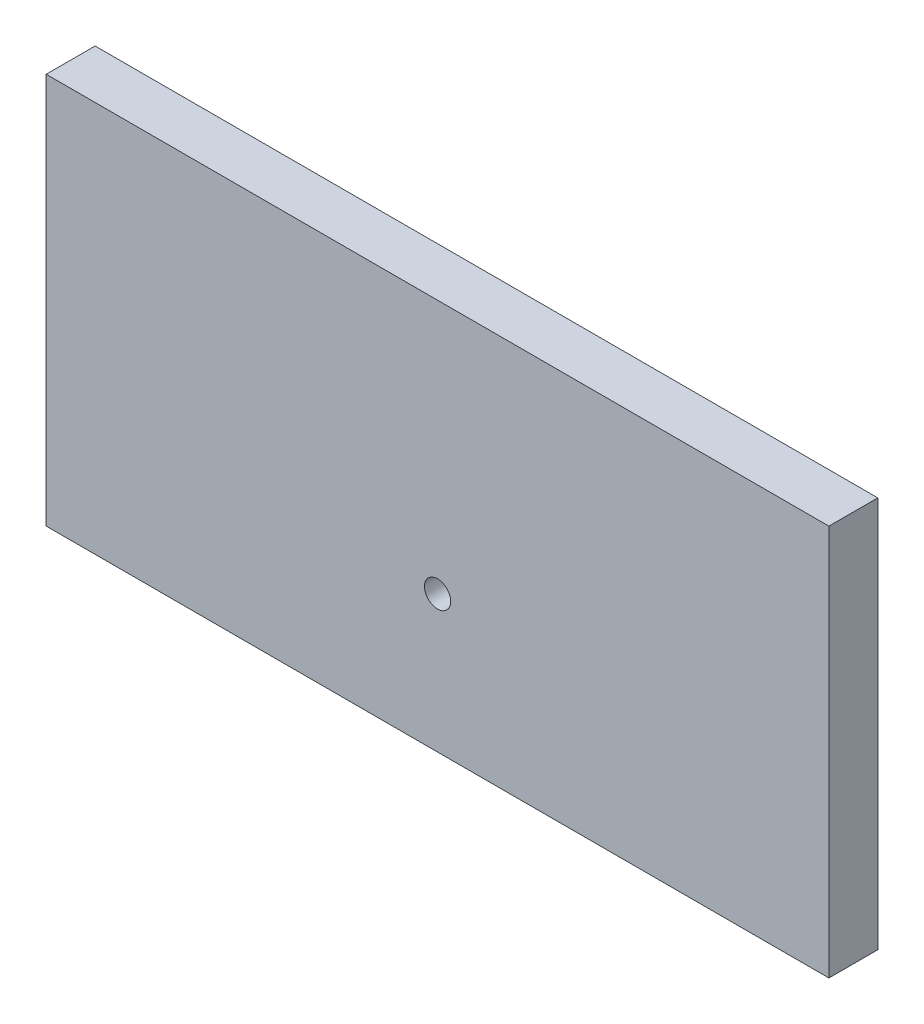
ISO-10303-21;
HEADER;
FILE_DESCRIPTION(('STEP AP214'),'2;1');
FILE_NAME('part.step','',(''),(''),'','','');
FILE_SCHEMA(('AUTOMOTIVE_DESIGN { 1 0 10303 214 1 1 1 1 }'));
ENDSEC;
DATA;
#1=APPLICATION_CONTEXT('core data for automotive mechanical design processes');
#2=APPLICATION_PROTOCOL_DEFINITION('international standard','automotive_design',2000,#1);
#3=PRODUCT_CONTEXT('',#1,'mechanical');
#4=PRODUCT('Part','Part','',(#3));
#5=PRODUCT_RELATED_PRODUCT_CATEGORY('part','',(#4));
#6=PRODUCT_DEFINITION_FORMATION('','',#4);
#7=PRODUCT_DEFINITION_CONTEXT('part definition',#1,'design');
#8=PRODUCT_DEFINITION('design','',#6,#7);
#9=PRODUCT_DEFINITION_SHAPE('','',#8);
#10=(LENGTH_UNIT() NAMED_UNIT(*) SI_UNIT(.MILLI.,.METRE.));
#11=(NAMED_UNIT(*) PLANE_ANGLE_UNIT() SI_UNIT($,.RADIAN.));
#12=(NAMED_UNIT(*) SI_UNIT($,.STERADIAN.) SOLID_ANGLE_UNIT());
#13=UNCERTAINTY_MEASURE_WITH_UNIT(LENGTH_MEASURE(1.E-05),#10,'distance_accuracy_value','');
#14=(GEOMETRIC_REPRESENTATION_CONTEXT(3) GLOBAL_UNCERTAINTY_ASSIGNED_CONTEXT((#13)) GLOBAL_UNIT_ASSIGNED_CONTEXT((#10,
#11,#12)) REPRESENTATION_CONTEXT('',''));
#15=CARTESIAN_POINT('',(0.,0.,0.));
#16=DIRECTION('',(0.,0.,1.));
#17=DIRECTION('',(1.,0.,0.));
#18=AXIS2_PLACEMENT_3D('',#15,#16,#17);
#19=CARTESIAN_POINT('',(0.,50.8,0.));
#20=DIRECTION('',(0.,0.,-1.));
#21=DIRECTION('',(-1.,0.,0.));
#22=AXIS2_PLACEMENT_3D('',#19,#20,#21);
#23=PLANE('',#22);
#24=DIRECTION('',(1.,0.,0.));
#25=VECTOR('',#24,1.);
#26=CARTESIAN_POINT('',(0.,0.,0.));
#27=LINE('',#26,#25);
#28=CARTESIAN_POINT('',(0.,0.,0.));
#29=VERTEX_POINT('',#28);
#30=CARTESIAN_POINT('',(101.6,0.,0.));
#31=VERTEX_POINT('',#30);
#32=EDGE_CURVE('E103',#29,#31,#27,.T.);
#33=ORIENTED_EDGE('',*,*,#32,.T.);
#34=DIRECTION('',(0.,-1.,0.));
#35=VECTOR('',#34,1.);
#36=CARTESIAN_POINT('',(101.6,50.8,0.));
#37=LINE('',#36,#35);
#38=CARTESIAN_POINT('',(101.6,50.8,0.));
#39=VERTEX_POINT('',#38);
#40=EDGE_CURVE('E55',#39,#31,#37,.T.);
#41=ORIENTED_EDGE('',*,*,#40,.F.);
#42=DIRECTION('',(1.,0.,0.));
#43=VECTOR('',#42,1.);
#44=CARTESIAN_POINT('',(0.,50.8,0.));
#45=LINE('',#44,#43);
#46=CARTESIAN_POINT('',(0.,50.8,0.));
#47=VERTEX_POINT('',#46);
#48=EDGE_CURVE('E93',#47,#39,#45,.T.);
#49=ORIENTED_EDGE('',*,*,#48,.F.);
#50=DIRECTION('',(0.,-1.,0.));
#51=VECTOR('',#50,1.);
#52=CARTESIAN_POINT('',(0.,50.8,0.));
#53=LINE('',#52,#51);
#54=EDGE_CURVE('E11',#47,#29,#53,.T.);
#55=ORIENTED_EDGE('',*,*,#54,.T.);
#56=EDGE_LOOP('',(#33,#41,#49,#55));
#57=FACE_BOUND('',#56,.T.);
#58=CARTESIAN_POINT('',(50.8,17.78,0.));
#59=DIRECTION('',(0.,0.,1.));
#60=DIRECTION('',(1.,0.,0.));
#61=AXIS2_PLACEMENT_3D('',#58,#59,#60);
#62=CIRCLE('',#61,1.7);
#63=CARTESIAN_POINT('',(52.5,17.78,0.));
#64=VERTEX_POINT('',#63);
#65=EDGE_CURVE('E138',#64,#64,#62,.T.);
#66=ORIENTED_EDGE('',*,*,#65,.F.);
#67=EDGE_LOOP('',(#66));
#68=FACE_BOUND('',#67,.T.);
#69=ADVANCED_FACE('F45',(#57,#68),#23,.F.);
#70=CARTESIAN_POINT('',(0.,50.8,0.));
#71=DIRECTION('',(1.,0.,0.));
#72=DIRECTION('',(0.,0.,-1.));
#73=AXIS2_PLACEMENT_3D('',#70,#71,#72);
#74=PLANE('',#73);
#75=DIRECTION('',(0.,0.,1.));
#76=VECTOR('',#75,1.);
#77=CARTESIAN_POINT('',(0.,0.,0.));
#78=LINE('',#77,#76);
#79=CARTESIAN_POINT('',(0.,0.,-6.35));
#80=VERTEX_POINT('',#79);
#81=EDGE_CURVE('E114',#80,#29,#78,.T.);
#82=ORIENTED_EDGE('',*,*,#81,.T.);
#83=ORIENTED_EDGE('',*,*,#54,.F.);
#84=DIRECTION('',(0.,0.,1.));
#85=VECTOR('',#84,1.);
#86=CARTESIAN_POINT('',(0.,50.8,0.));
#87=LINE('',#86,#85);
#88=CARTESIAN_POINT('',(0.,50.8,-6.35));
#89=VERTEX_POINT('',#88);
#90=EDGE_CURVE('E98',#89,#47,#87,.T.);
#91=ORIENTED_EDGE('',*,*,#90,.F.);
#92=DIRECTION('',(0.,-1.,0.));
#93=VECTOR('',#92,1.);
#94=CARTESIAN_POINT('',(0.,50.8,-6.35));
#95=LINE('',#94,#93);
#96=EDGE_CURVE('E110',#89,#80,#95,.T.);
#97=ORIENTED_EDGE('',*,*,#96,.T.);
#98=EDGE_LOOP('',(#82,#83,#91,#97));
#99=FACE_BOUND('',#98,.T.);
#100=ADVANCED_FACE('F47',(#99),#74,.F.);
#101=CARTESIAN_POINT('',(101.6,50.8,0.));
#102=DIRECTION('',(-1.,0.,0.));
#103=DIRECTION('',(0.,0.,1.));
#104=AXIS2_PLACEMENT_3D('',#101,#102,#103);
#105=PLANE('',#104);
#106=DIRECTION('',(0.,0.,-1.));
#107=VECTOR('',#106,1.);
#108=CARTESIAN_POINT('',(101.6,0.,0.));
#109=LINE('',#108,#107);
#110=CARTESIAN_POINT('',(101.6,0.,-6.35));
#111=VERTEX_POINT('',#110);
#112=EDGE_CURVE('E80',#31,#111,#109,.T.);
#113=ORIENTED_EDGE('',*,*,#112,.T.);
#114=DIRECTION('',(0.,-1.,0.));
#115=VECTOR('',#114,1.);
#116=CARTESIAN_POINT('',(101.6,50.8,-6.35));
#117=LINE('',#116,#115);
#118=CARTESIAN_POINT('',(101.6,50.8,-6.35));
#119=VERTEX_POINT('',#118);
#120=EDGE_CURVE('E105',#119,#111,#117,.T.);
#121=ORIENTED_EDGE('',*,*,#120,.F.);
#122=DIRECTION('',(0.,0.,-1.));
#123=VECTOR('',#122,1.);
#124=CARTESIAN_POINT('',(101.6,50.8,0.));
#125=LINE('',#124,#123);
#126=EDGE_CURVE('E96',#39,#119,#125,.T.);
#127=ORIENTED_EDGE('',*,*,#126,.F.);
#128=ORIENTED_EDGE('',*,*,#40,.T.);
#129=EDGE_LOOP('',(#113,#121,#127,#128));
#130=FACE_BOUND('',#129,.T.);
#131=ADVANCED_FACE('F106',(#130),#105,.F.);
#132=CARTESIAN_POINT('',(0.,50.8,-6.35));
#133=DIRECTION('',(0.,0.,1.));
#134=DIRECTION('',(1.,0.,0.));
#135=AXIS2_PLACEMENT_3D('',#132,#133,#134);
#136=PLANE('',#135);
#137=CARTESIAN_POINT('',(50.8,17.78,-6.35));
#138=DIRECTION('',(0.,0.,1.));
#139=DIRECTION('',(1.,0.,0.));
#140=AXIS2_PLACEMENT_3D('',#137,#138,#139);
#141=CIRCLE('',#140,1.7);
#142=CARTESIAN_POINT('',(52.5,17.78,-6.35));
#143=VERTEX_POINT('',#142);
#144=EDGE_CURVE('E118',#143,#143,#141,.T.);
#145=ORIENTED_EDGE('',*,*,#144,.T.);
#146=EDGE_LOOP('',(#145));
#147=FACE_BOUND('',#146,.T.);
#148=DIRECTION('',(-1.,0.,0.));
#149=VECTOR('',#148,1.);
#150=CARTESIAN_POINT('',(0.,0.,-6.35));
#151=LINE('',#150,#149);
#152=EDGE_CURVE('E86',#111,#80,#151,.T.);
#153=ORIENTED_EDGE('',*,*,#152,.T.);
#154=ORIENTED_EDGE('',*,*,#96,.F.);
#155=DIRECTION('',(-1.,0.,0.));
#156=VECTOR('',#155,1.);
#157=CARTESIAN_POINT('',(0.,50.8,-6.35));
#158=LINE('',#157,#156);
#159=EDGE_CURVE('E63',#119,#89,#158,.T.);
#160=ORIENTED_EDGE('',*,*,#159,.F.);
#161=ORIENTED_EDGE('',*,*,#120,.T.);
#162=EDGE_LOOP('',(#153,#154,#160,#161));
#163=FACE_BOUND('',#162,.T.);
#164=ADVANCED_FACE('F128',(#147,#163),#136,.F.);
#165=CARTESIAN_POINT('',(0.,50.8,0.));
#166=DIRECTION('',(0.,-1.,0.));
#167=DIRECTION('',(0.,0.,-1.));
#168=AXIS2_PLACEMENT_3D('',#165,#166,#167);
#169=PLANE('',#168);
#170=ORIENTED_EDGE('',*,*,#90,.T.);
#171=ORIENTED_EDGE('',*,*,#48,.T.);
#172=ORIENTED_EDGE('',*,*,#126,.T.);
#173=ORIENTED_EDGE('',*,*,#159,.T.);
#174=EDGE_LOOP('',(#170,#171,#172,#173));
#175=FACE_BOUND('',#174,.T.);
#176=ADVANCED_FACE('F94',(#175),#169,.F.);
#177=CARTESIAN_POINT('',(0.,0.,0.));
#178=DIRECTION('',(0.,-1.,0.));
#179=DIRECTION('',(0.,0.,-1.));
#180=AXIS2_PLACEMENT_3D('',#177,#178,#179);
#181=PLANE('',#180);
#182=ORIENTED_EDGE('',*,*,#81,.F.);
#183=ORIENTED_EDGE('',*,*,#152,.F.);
#184=ORIENTED_EDGE('',*,*,#112,.F.);
#185=ORIENTED_EDGE('',*,*,#32,.F.);
#186=EDGE_LOOP('',(#182,#183,#184,#185));
#187=FACE_BOUND('',#186,.T.);
#188=ADVANCED_FACE('F131',(#187),#181,.T.);
#189=CARTESIAN_POINT('',(50.8,17.78,0.));
#190=DIRECTION('',(0.,0.,1.));
#191=DIRECTION('',(1.,0.,0.));
#192=AXIS2_PLACEMENT_3D('',#189,#190,#191);
#193=CYLINDRICAL_SURFACE('',#192,1.7);
#194=ORIENTED_EDGE('',*,*,#144,.F.);
#195=EDGE_LOOP('',(#194));
#196=FACE_BOUND('',#195,.T.);
#197=ORIENTED_EDGE('',*,*,#65,.T.);
#198=EDGE_LOOP('',(#197));
#199=FACE_BOUND('',#198,.T.);
#200=ADVANCED_FACE('F143',(#196,#199),#193,.F.);
#201=CLOSED_SHELL('',(#69,#100,#131,#164,#176,#188,#200));
#202=MANIFOLD_SOLID_BREP('B2',#201);
#203=ADVANCED_BREP_SHAPE_REPRESENTATION('',(#18,#202),#14);
#204=SHAPE_DEFINITION_REPRESENTATION(#9,#203);
ENDSEC;
END-ISO-10303-21;
